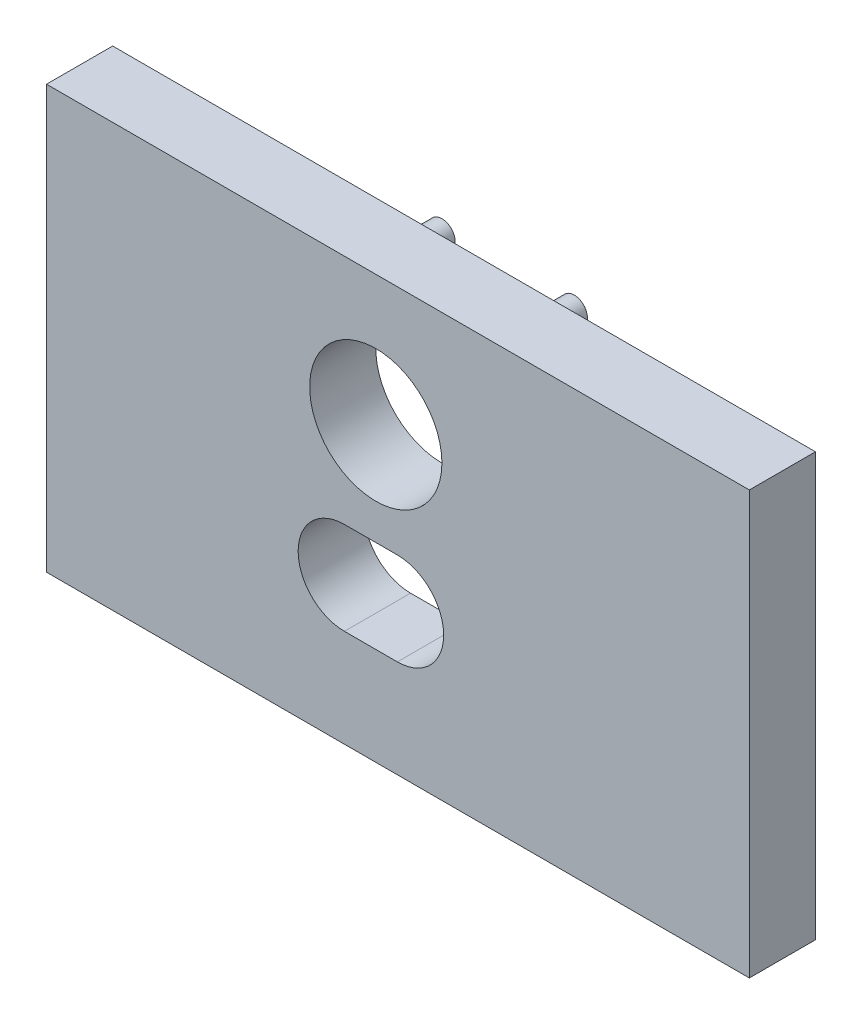
ISO-10303-21;
HEADER;
FILE_DESCRIPTION(('STEP AP214'),'2;1');
FILE_NAME('part.step','',(''),(''),'','','');
FILE_SCHEMA(('AUTOMOTIVE_DESIGN { 1 0 10303 214 1 1 1 1 }'));
ENDSEC;
DATA;
#1=APPLICATION_CONTEXT('core data for automotive mechanical design processes');
#2=APPLICATION_PROTOCOL_DEFINITION('international standard','automotive_design',2000,#1);
#3=PRODUCT_CONTEXT('',#1,'mechanical');
#4=PRODUCT('Part','Part','',(#3));
#5=PRODUCT_RELATED_PRODUCT_CATEGORY('part','',(#4));
#6=PRODUCT_DEFINITION_FORMATION('','',#4);
#7=PRODUCT_DEFINITION_CONTEXT('part definition',#1,'design');
#8=PRODUCT_DEFINITION('design','',#6,#7);
#9=PRODUCT_DEFINITION_SHAPE('','',#8);
#10=(LENGTH_UNIT() NAMED_UNIT(*) SI_UNIT(.MILLI.,.METRE.));
#11=(NAMED_UNIT(*) PLANE_ANGLE_UNIT() SI_UNIT($,.RADIAN.));
#12=(NAMED_UNIT(*) SI_UNIT($,.STERADIAN.) SOLID_ANGLE_UNIT());
#13=UNCERTAINTY_MEASURE_WITH_UNIT(LENGTH_MEASURE(1.E-05),#10,'distance_accuracy_value','');
#14=(GEOMETRIC_REPRESENTATION_CONTEXT(3) GLOBAL_UNCERTAINTY_ASSIGNED_CONTEXT((#13)) GLOBAL_UNIT_ASSIGNED_CONTEXT((#10,
#11,#12)) REPRESENTATION_CONTEXT('',''));
#15=CARTESIAN_POINT('',(0.,0.,0.));
#16=DIRECTION('',(0.,0.,1.));
#17=DIRECTION('',(1.,0.,0.));
#18=AXIS2_PLACEMENT_3D('',#15,#16,#17);
#19=CARTESIAN_POINT('',(-40.8718738065203,31.4899209554781,5.));
#20=DIRECTION('',(1.,0.,0.));
#21=DIRECTION('',(0.,0.,-1.));
#22=AXIS2_PLACEMENT_3D('',#19,#20,#21);
#23=PLANE('',#22);
#24=DIRECTION('',(0.,-1.,0.));
#25=VECTOR('',#24,1.);
#26=CARTESIAN_POINT('',(-40.8718738065203,31.4899209554781,0.));
#27=LINE('',#26,#25);
#28=CARTESIAN_POINT('',(-40.8718738065203,31.4899209554781,0.));
#29=VERTEX_POINT('',#28);
#30=CARTESIAN_POINT('',(-40.8718738065203,-0.464453111437724,0.));
#31=VERTEX_POINT('',#30);
#32=EDGE_CURVE('E184',#29,#31,#27,.T.);
#33=ORIENTED_EDGE('',*,*,#32,.T.);
#34=DIRECTION('',(0.,0.,-1.));
#35=VECTOR('',#34,1.);
#36=CARTESIAN_POINT('',(-40.8718738065203,-0.464453111437724,5.));
#37=LINE('',#36,#35);
#38=CARTESIAN_POINT('',(-40.8718738065203,-0.464453111437724,5.));
#39=VERTEX_POINT('',#38);
#40=EDGE_CURVE('E207',#39,#31,#37,.T.);
#41=ORIENTED_EDGE('',*,*,#40,.F.);
#42=DIRECTION('',(0.,-1.,0.));
#43=VECTOR('',#42,1.);
#44=CARTESIAN_POINT('',(-40.8718738065203,31.4899209554781,5.));
#45=LINE('',#44,#43);
#46=CARTESIAN_POINT('',(-40.8718738065203,31.4899209554781,5.));
#47=VERTEX_POINT('',#46);
#48=EDGE_CURVE('E169',#47,#39,#45,.T.);
#49=ORIENTED_EDGE('',*,*,#48,.F.);
#50=DIRECTION('',(0.,0.,-1.));
#51=VECTOR('',#50,1.);
#52=CARTESIAN_POINT('',(-40.8718738065203,31.4899209554781,5.));
#53=LINE('',#52,#51);
#54=EDGE_CURVE('E183',#47,#29,#53,.T.);
#55=ORIENTED_EDGE('',*,*,#54,.T.);
#56=EDGE_LOOP('',(#33,#41,#49,#55));
#57=FACE_BOUND('',#56,.T.);
#58=ADVANCED_FACE('F43',(#57),#23,.F.);
#59=CARTESIAN_POINT('',(-40.8718738065203,-0.464453111437724,5.));
#60=DIRECTION('',(0.,1.,0.));
#61=DIRECTION('',(0.,0.,1.));
#62=AXIS2_PLACEMENT_3D('',#59,#60,#61);
#63=PLANE('',#62);
#64=DIRECTION('',(1.,0.,0.));
#65=VECTOR('',#64,1.);
#66=CARTESIAN_POINT('',(-40.8718738065203,-0.464453111437724,0.));
#67=LINE('',#66,#65);
#68=CARTESIAN_POINT('',(12.2615621419561,-0.464453111437724,0.));
#69=VERTEX_POINT('',#68);
#70=EDGE_CURVE('E188',#31,#69,#67,.T.);
#71=ORIENTED_EDGE('',*,*,#70,.T.);
#72=DIRECTION('',(0.,0.,-1.));
#73=VECTOR('',#72,1.);
#74=CARTESIAN_POINT('',(12.2615621419561,-0.464453111437724,5.));
#75=LINE('',#74,#73);
#76=CARTESIAN_POINT('',(12.2615621419561,-0.464453111437724,5.));
#77=VERTEX_POINT('',#76);
#78=EDGE_CURVE('E203',#77,#69,#75,.T.);
#79=ORIENTED_EDGE('',*,*,#78,.F.);
#80=DIRECTION('',(1.,0.,0.));
#81=VECTOR('',#80,1.);
#82=CARTESIAN_POINT('',(-40.8718738065203,-0.464453111437724,5.));
#83=LINE('',#82,#81);
#84=EDGE_CURVE('E173',#39,#77,#83,.T.);
#85=ORIENTED_EDGE('',*,*,#84,.F.);
#86=ORIENTED_EDGE('',*,*,#40,.T.);
#87=EDGE_LOOP('',(#71,#79,#85,#86));
#88=FACE_BOUND('',#87,.T.);
#89=ADVANCED_FACE('F242',(#88),#63,.F.);
#90=CARTESIAN_POINT('',(12.2615621419561,31.4899209554781,5.));
#91=DIRECTION('',(-1.,0.,0.));
#92=DIRECTION('',(0.,0.,1.));
#93=AXIS2_PLACEMENT_3D('',#90,#91,#92);
#94=PLANE('',#93);
#95=DIRECTION('',(0.,1.,0.));
#96=VECTOR('',#95,1.);
#97=CARTESIAN_POINT('',(12.2615621419561,31.4899209554781,0.));
#98=LINE('',#97,#96);
#99=CARTESIAN_POINT('',(12.2615621419561,31.4899209554781,0.));
#100=VERTEX_POINT('',#99);
#101=EDGE_CURVE('E191',#69,#100,#98,.T.);
#102=ORIENTED_EDGE('',*,*,#101,.T.);
#103=DIRECTION('',(0.,0.,-1.));
#104=VECTOR('',#103,1.);
#105=CARTESIAN_POINT('',(12.2615621419561,31.4899209554781,5.));
#106=LINE('',#105,#104);
#107=CARTESIAN_POINT('',(12.2615621419561,31.4899209554781,5.));
#108=VERTEX_POINT('',#107);
#109=EDGE_CURVE('E199',#108,#100,#106,.T.);
#110=ORIENTED_EDGE('',*,*,#109,.F.);
#111=DIRECTION('',(0.,1.,0.));
#112=VECTOR('',#111,1.);
#113=CARTESIAN_POINT('',(12.2615621419561,31.4899209554781,5.));
#114=LINE('',#113,#112);
#115=EDGE_CURVE('E177',#77,#108,#114,.T.);
#116=ORIENTED_EDGE('',*,*,#115,.F.);
#117=ORIENTED_EDGE('',*,*,#78,.T.);
#118=EDGE_LOOP('',(#102,#110,#116,#117));
#119=FACE_BOUND('',#118,.T.);
#120=ADVANCED_FACE('F239',(#119),#94,.F.);
#121=CARTESIAN_POINT('',(-40.8718738065203,31.4899209554781,5.));
#122=DIRECTION('',(0.,-1.,0.));
#123=DIRECTION('',(0.,0.,-1.));
#124=AXIS2_PLACEMENT_3D('',#121,#122,#123);
#125=PLANE('',#124);
#126=DIRECTION('',(-1.,0.,0.));
#127=VECTOR('',#126,1.);
#128=CARTESIAN_POINT('',(-40.8718738065203,31.4899209554781,0.));
#129=LINE('',#128,#127);
#130=EDGE_CURVE('E174',#100,#29,#129,.T.);
#131=ORIENTED_EDGE('',*,*,#130,.T.);
#132=ORIENTED_EDGE('',*,*,#54,.F.);
#133=DIRECTION('',(-1.,0.,0.));
#134=VECTOR('',#133,1.);
#135=CARTESIAN_POINT('',(-40.8718738065203,31.4899209554781,5.));
#136=LINE('',#135,#134);
#137=EDGE_CURVE('E180',#108,#47,#136,.T.);
#138=ORIENTED_EDGE('',*,*,#137,.F.);
#139=ORIENTED_EDGE('',*,*,#109,.T.);
#140=EDGE_LOOP('',(#131,#132,#138,#139));
#141=FACE_BOUND('',#140,.T.);
#142=ADVANCED_FACE('F235',(#141),#125,.F.);
#143=CARTESIAN_POINT('',(0.,0.,5.));
#144=DIRECTION('',(0.,0.,1.));
#145=DIRECTION('',(1.,0.,0.));
#146=AXIS2_PLACEMENT_3D('',#143,#144,#145);
#147=PLANE('',#146);
#148=CARTESIAN_POINT('',(-18.3493169338283,10.4275316695352,5.));
#149=DIRECTION('',(0.,0.,1.));
#150=DIRECTION('',(1.,0.,0.));
#151=AXIS2_PLACEMENT_3D('',#148,#149,#150);
#152=CIRCLE('',#151,3.5);
#153=CARTESIAN_POINT('',(-18.3493169338283,13.9275316695352,5.));
#154=VERTEX_POINT('',#153);
#155=CARTESIAN_POINT('',(-18.3493169338283,6.92753166953518,5.));
#156=VERTEX_POINT('',#155);
#157=EDGE_CURVE('E58',#154,#156,#152,.T.);
#158=ORIENTED_EDGE('',*,*,#157,.F.);
#159=DIRECTION('',(-1.,0.,0.));
#160=VECTOR('',#159,1.);
#161=CARTESIAN_POINT('',(-18.3493169338283,13.9275316695352,5.));
#162=LINE('',#161,#160);
#163=CARTESIAN_POINT('',(-14.3493169338283,13.9275316695352,5.));
#164=VERTEX_POINT('',#163);
#165=EDGE_CURVE('E129',#164,#154,#162,.T.);
#166=ORIENTED_EDGE('',*,*,#165,.F.);
#167=CARTESIAN_POINT('',(-14.3493169338283,10.4275316695352,5.));
#168=DIRECTION('',(0.,0.,1.));
#169=DIRECTION('',(1.,0.,0.));
#170=AXIS2_PLACEMENT_3D('',#167,#168,#169);
#171=CIRCLE('',#170,3.5);
#172=CARTESIAN_POINT('',(-14.3493169338283,6.92753166953518,5.));
#173=VERTEX_POINT('',#172);
#174=EDGE_CURVE('E133',#173,#164,#171,.T.);
#175=ORIENTED_EDGE('',*,*,#174,.F.);
#176=DIRECTION('',(1.,0.,0.));
#177=VECTOR('',#176,1.);
#178=CARTESIAN_POINT('',(-18.3493169338283,6.92753166953518,5.));
#179=LINE('',#178,#177);
#180=EDGE_CURVE('E142',#156,#173,#179,.T.);
#181=ORIENTED_EDGE('',*,*,#180,.F.);
#182=EDGE_LOOP('',(#158,#166,#175,#181));
#183=FACE_BOUND('',#182,.T.);
#184=CARTESIAN_POINT('',(-15.9791813616617,21.6315483939005,5.));
#185=DIRECTION('',(0.,0.,1.));
#186=DIRECTION('',(1.,0.,0.));
#187=AXIS2_PLACEMENT_3D('',#184,#185,#186);
#188=CIRCLE('',#187,5.);
#189=CARTESIAN_POINT('',(-10.9791813616617,21.6315483939005,5.));
#190=VERTEX_POINT('',#189);
#191=EDGE_CURVE('E164',#190,#190,#188,.T.);
#192=ORIENTED_EDGE('',*,*,#191,.F.);
#193=EDGE_LOOP('',(#192));
#194=FACE_BOUND('',#193,.T.);
#195=ORIENTED_EDGE('',*,*,#48,.T.);
#196=ORIENTED_EDGE('',*,*,#84,.T.);
#197=ORIENTED_EDGE('',*,*,#115,.T.);
#198=ORIENTED_EDGE('',*,*,#137,.T.);
#199=EDGE_LOOP('',(#195,#196,#197,#198));
#200=FACE_BOUND('',#199,.T.);
#201=ADVANCED_FACE('F222',(#183,#194,#200),#147,.T.);
#202=CARTESIAN_POINT('',(0.,0.,0.));
#203=DIRECTION('',(0.,0.,1.));
#204=DIRECTION('',(1.,0.,0.));
#205=AXIS2_PLACEMENT_3D('',#202,#203,#204);
#206=PLANE('',#205);
#207=DIRECTION('',(-1.,0.,0.));
#208=VECTOR('',#207,1.);
#209=CARTESIAN_POINT('',(-18.3493169338283,13.9275316695352,0.));
#210=LINE('',#209,#208);
#211=CARTESIAN_POINT('',(-14.3493169338283,13.9275316695352,0.));
#212=VERTEX_POINT('',#211);
#213=CARTESIAN_POINT('',(-18.3493169338283,13.9275316695352,0.));
#214=VERTEX_POINT('',#213);
#215=EDGE_CURVE('E117',#212,#214,#210,.T.);
#216=ORIENTED_EDGE('',*,*,#215,.T.);
#217=CARTESIAN_POINT('',(-18.3493169338283,10.4275316695352,0.));
#218=DIRECTION('',(0.,0.,1.));
#219=DIRECTION('',(1.,0.,0.));
#220=AXIS2_PLACEMENT_3D('',#217,#218,#219);
#221=CIRCLE('',#220,3.5);
#222=CARTESIAN_POINT('',(-18.3493169338283,6.92753166953518,0.));
#223=VERTEX_POINT('',#222);
#224=EDGE_CURVE('E110',#214,#223,#221,.T.);
#225=ORIENTED_EDGE('',*,*,#224,.T.);
#226=DIRECTION('',(1.,0.,0.));
#227=VECTOR('',#226,1.);
#228=CARTESIAN_POINT('',(-18.3493169338283,6.92753166953518,0.));
#229=LINE('',#228,#227);
#230=CARTESIAN_POINT('',(-14.3493169338283,6.92753166953518,0.));
#231=VERTEX_POINT('',#230);
#232=EDGE_CURVE('E120',#223,#231,#229,.T.);
#233=ORIENTED_EDGE('',*,*,#232,.T.);
#234=CARTESIAN_POINT('',(-14.3493169338283,10.4275316695352,0.));
#235=DIRECTION('',(0.,0.,1.));
#236=DIRECTION('',(1.,0.,0.));
#237=AXIS2_PLACEMENT_3D('',#234,#235,#236);
#238=CIRCLE('',#237,3.5);
#239=EDGE_CURVE('E66',#231,#212,#238,.T.);
#240=ORIENTED_EDGE('',*,*,#239,.T.);
#241=EDGE_LOOP('',(#216,#225,#233,#240));
#242=FACE_BOUND('',#241,.T.);
#243=CARTESIAN_POINT('',(-20.9791813616617,26.6315483939005,0.));
#244=DIRECTION('',(0.,0.,1.));
#245=DIRECTION('',(1.,0.,0.));
#246=AXIS2_PLACEMENT_3D('',#243,#244,#245);
#247=CIRCLE('',#246,1.);
#248=CARTESIAN_POINT('',(-19.9791813616617,26.6315483939005,0.));
#249=VERTEX_POINT('',#248);
#250=EDGE_CURVE('E11',#249,#249,#247,.F.);
#251=ORIENTED_EDGE('',*,*,#250,.F.);
#252=EDGE_LOOP('',(#251));
#253=FACE_BOUND('',#252,.T.);
#254=CARTESIAN_POINT('',(-10.9791813616617,26.6315483939005,0.));
#255=DIRECTION('',(0.,0.,1.));
#256=DIRECTION('',(1.,0.,0.));
#257=AXIS2_PLACEMENT_3D('',#254,#255,#256);
#258=CIRCLE('',#257,1.);
#259=CARTESIAN_POINT('',(-9.97918136166169,26.6315483939005,0.));
#260=VERTEX_POINT('',#259);
#261=EDGE_CURVE('E51',#260,#260,#258,.F.);
#262=ORIENTED_EDGE('',*,*,#261,.F.);
#263=EDGE_LOOP('',(#262));
#264=FACE_BOUND('',#263,.T.);
#265=CARTESIAN_POINT('',(-15.9791813616617,21.6315483939005,0.));
#266=DIRECTION('',(0.,0.,1.));
#267=DIRECTION('',(1.,0.,0.));
#268=AXIS2_PLACEMENT_3D('',#265,#266,#267);
#269=CIRCLE('',#268,5.);
#270=CARTESIAN_POINT('',(-10.9791813616617,21.6315483939005,0.));
#271=VERTEX_POINT('',#270);
#272=EDGE_CURVE('E168',#271,#271,#269,.T.);
#273=ORIENTED_EDGE('',*,*,#272,.T.);
#274=EDGE_LOOP('',(#273));
#275=FACE_BOUND('',#274,.T.);
#276=ORIENTED_EDGE('',*,*,#32,.F.);
#277=ORIENTED_EDGE('',*,*,#130,.F.);
#278=ORIENTED_EDGE('',*,*,#101,.F.);
#279=ORIENTED_EDGE('',*,*,#70,.F.);
#280=EDGE_LOOP('',(#276,#277,#278,#279));
#281=FACE_BOUND('',#280,.T.);
#282=ADVANCED_FACE('F125',(#242,#253,#264,#275,#281),#206,.F.);
#283=CARTESIAN_POINT('',(-15.9791813616617,21.6315483939005,-5.));
#284=DIRECTION('',(0.,0.,1.));
#285=DIRECTION('',(1.,0.,0.));
#286=AXIS2_PLACEMENT_3D('',#283,#284,#285);
#287=CYLINDRICAL_SURFACE('',#286,5.);
#288=ORIENTED_EDGE('',*,*,#191,.T.);
#289=EDGE_LOOP('',(#288));
#290=FACE_BOUND('',#289,.T.);
#291=ORIENTED_EDGE('',*,*,#272,.F.);
#292=EDGE_LOOP('',(#291));
#293=FACE_BOUND('',#292,.T.);
#294=ADVANCED_FACE('F221',(#290,#293),#287,.F.);
#295=CARTESIAN_POINT('',(-10.9791813616617,26.6315483939005,-5.));
#296=DIRECTION('',(0.,0.,1.));
#297=DIRECTION('',(1.,0.,0.));
#298=AXIS2_PLACEMENT_3D('',#295,#296,#297);
#299=CYLINDRICAL_SURFACE('',#298,1.);
#300=CARTESIAN_POINT('',(-10.9791813616617,26.6315483939005,-5.));
#301=DIRECTION('',(0.,0.,-1.));
#302=DIRECTION('',(-1.,0.,0.));
#303=AXIS2_PLACEMENT_3D('',#300,#301,#302);
#304=CIRCLE('',#303,1.);
#305=CARTESIAN_POINT('',(-11.9791813616617,26.6315483939005,-5.));
#306=VERTEX_POINT('',#305);
#307=EDGE_CURVE('E160',#306,#306,#304,.T.);
#308=ORIENTED_EDGE('',*,*,#307,.F.);
#309=EDGE_LOOP('',(#308));
#310=FACE_BOUND('',#309,.T.);
#311=ORIENTED_EDGE('',*,*,#261,.T.);
#312=EDGE_LOOP('',(#311));
#313=FACE_BOUND('',#312,.T.);
#314=ADVANCED_FACE('F217',(#310,#313),#299,.T.);
#315=CARTESIAN_POINT('',(-10.9791813616617,26.6315483939005,-5.));
#316=DIRECTION('',(0.,0.,-1.));
#317=DIRECTION('',(-1.,0.,0.));
#318=AXIS2_PLACEMENT_3D('',#315,#316,#317);
#319=PLANE('',#318);
#320=ORIENTED_EDGE('',*,*,#307,.T.);
#321=EDGE_LOOP('',(#320));
#322=FACE_BOUND('',#321,.T.);
#323=ADVANCED_FACE('F288',(#322),#319,.T.);
#324=CARTESIAN_POINT('',(-20.9791813616617,26.6315483939005,-5.));
#325=DIRECTION('',(0.,0.,1.));
#326=DIRECTION('',(1.,0.,0.));
#327=AXIS2_PLACEMENT_3D('',#324,#325,#326);
#328=CYLINDRICAL_SURFACE('',#327,1.);
#329=CARTESIAN_POINT('',(-20.9791813616617,26.6315483939005,-5.));
#330=DIRECTION('',(0.,0.,-1.));
#331=DIRECTION('',(-1.,0.,0.));
#332=AXIS2_PLACEMENT_3D('',#329,#330,#331);
#333=CIRCLE('',#332,1.);
#334=CARTESIAN_POINT('',(-21.9791813616617,26.6315483939005,-5.));
#335=VERTEX_POINT('',#334);
#336=EDGE_CURVE('E151',#335,#335,#333,.T.);
#337=ORIENTED_EDGE('',*,*,#336,.F.);
#338=EDGE_LOOP('',(#337));
#339=FACE_BOUND('',#338,.T.);
#340=ORIENTED_EDGE('',*,*,#250,.T.);
#341=EDGE_LOOP('',(#340));
#342=FACE_BOUND('',#341,.T.);
#343=ADVANCED_FACE('F299',(#339,#342),#328,.T.);
#344=CARTESIAN_POINT('',(-20.9791813616617,26.6315483939005,-5.));
#345=DIRECTION('',(0.,0.,-1.));
#346=DIRECTION('',(-1.,0.,0.));
#347=AXIS2_PLACEMENT_3D('',#344,#345,#346);
#348=PLANE('',#347);
#349=ORIENTED_EDGE('',*,*,#336,.T.);
#350=EDGE_LOOP('',(#349));
#351=FACE_BOUND('',#350,.T.);
#352=ADVANCED_FACE('F310',(#351),#348,.T.);
#353=CARTESIAN_POINT('',(-18.3493169338283,10.4275316695352,0.));
#354=DIRECTION('',(0.,0.,1.));
#355=DIRECTION('',(1.,0.,0.));
#356=AXIS2_PLACEMENT_3D('',#353,#354,#355);
#357=CYLINDRICAL_SURFACE('',#356,3.5);
#358=ORIENTED_EDGE('',*,*,#157,.T.);
#359=DIRECTION('',(0.,0.,1.));
#360=VECTOR('',#359,1.);
#361=CARTESIAN_POINT('',(-18.3493169338283,6.92753166953518,0.));
#362=LINE('',#361,#360);
#363=EDGE_CURVE('E106',#223,#156,#362,.T.);
#364=ORIENTED_EDGE('',*,*,#363,.F.);
#365=ORIENTED_EDGE('',*,*,#224,.F.);
#366=DIRECTION('',(0.,0.,1.));
#367=VECTOR('',#366,1.);
#368=CARTESIAN_POINT('',(-18.3493169338283,13.9275316695352,0.));
#369=LINE('',#368,#367);
#370=EDGE_CURVE('E148',#214,#154,#369,.T.);
#371=ORIENTED_EDGE('',*,*,#370,.T.);
#372=EDGE_LOOP('',(#358,#364,#365,#371));
#373=FACE_BOUND('',#372,.T.);
#374=ADVANCED_FACE('F108',(#373),#357,.F.);
#375=CARTESIAN_POINT('',(-18.3493169338283,13.9275316695352,0.));
#376=DIRECTION('',(0.,1.,0.));
#377=DIRECTION('',(0.,0.,1.));
#378=AXIS2_PLACEMENT_3D('',#375,#376,#377);
#379=PLANE('',#378);
#380=ORIENTED_EDGE('',*,*,#165,.T.);
#381=ORIENTED_EDGE('',*,*,#370,.F.);
#382=ORIENTED_EDGE('',*,*,#215,.F.);
#383=DIRECTION('',(0.,0.,1.));
#384=VECTOR('',#383,1.);
#385=CARTESIAN_POINT('',(-14.3493169338283,13.9275316695352,0.));
#386=LINE('',#385,#384);
#387=EDGE_CURVE('E152',#212,#164,#386,.T.);
#388=ORIENTED_EDGE('',*,*,#387,.T.);
#389=EDGE_LOOP('',(#380,#381,#382,#388));
#390=FACE_BOUND('',#389,.T.);
#391=ADVANCED_FACE('F341',(#390),#379,.F.);
#392=CARTESIAN_POINT('',(-14.3493169338283,10.4275316695352,0.));
#393=DIRECTION('',(0.,0.,1.));
#394=DIRECTION('',(1.,0.,0.));
#395=AXIS2_PLACEMENT_3D('',#392,#393,#394);
#396=CYLINDRICAL_SURFACE('',#395,3.5);
#397=ORIENTED_EDGE('',*,*,#174,.T.);
#398=ORIENTED_EDGE('',*,*,#387,.F.);
#399=ORIENTED_EDGE('',*,*,#239,.F.);
#400=DIRECTION('',(0.,0.,1.));
#401=VECTOR('',#400,1.);
#402=CARTESIAN_POINT('',(-14.3493169338283,6.92753166953518,0.));
#403=LINE('',#402,#401);
#404=EDGE_CURVE('E116',#231,#173,#403,.T.);
#405=ORIENTED_EDGE('',*,*,#404,.T.);
#406=EDGE_LOOP('',(#397,#398,#399,#405));
#407=FACE_BOUND('',#406,.T.);
#408=ADVANCED_FACE('F351',(#407),#396,.F.);
#409=CARTESIAN_POINT('',(-18.3493169338283,6.92753166953518,0.));
#410=DIRECTION('',(0.,-1.,0.));
#411=DIRECTION('',(0.,0.,-1.));
#412=AXIS2_PLACEMENT_3D('',#409,#410,#411);
#413=PLANE('',#412);
#414=ORIENTED_EDGE('',*,*,#180,.T.);
#415=ORIENTED_EDGE('',*,*,#404,.F.);
#416=ORIENTED_EDGE('',*,*,#232,.F.);
#417=ORIENTED_EDGE('',*,*,#363,.T.);
#418=EDGE_LOOP('',(#414,#415,#416,#417));
#419=FACE_BOUND('',#418,.T.);
#420=ADVANCED_FACE('F121',(#419),#413,.F.);
#421=CLOSED_SHELL('',(#58,#89,#120,#142,#201,#282,#294,#314,#323,#343,#352,#374,#391,#408,#420));
#422=MANIFOLD_SOLID_BREP('B2',#421);
#423=ADVANCED_BREP_SHAPE_REPRESENTATION('',(#18,#422),#14);
#424=SHAPE_DEFINITION_REPRESENTATION(#9,#423);
ENDSEC;
END-ISO-10303-21;
